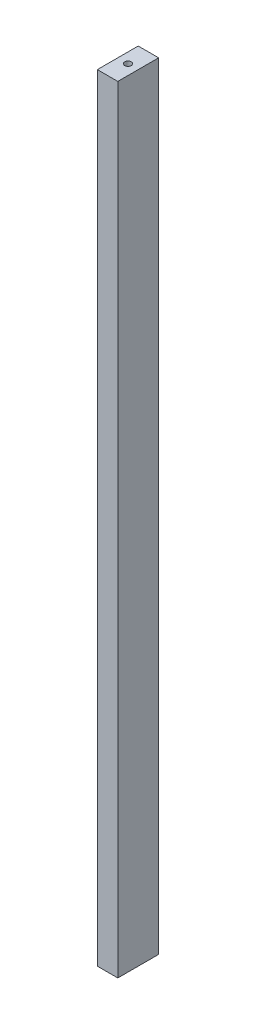
ISO-10303-21;
HEADER;
FILE_DESCRIPTION(('STEP AP214'),'2;1');
FILE_NAME('part.step','',(''),(''),'','','');
FILE_SCHEMA(('AUTOMOTIVE_DESIGN { 1 0 10303 214 1 1 1 1 }'));
ENDSEC;
DATA;
#1=APPLICATION_CONTEXT('core data for automotive mechanical design processes');
#2=APPLICATION_PROTOCOL_DEFINITION('international standard','automotive_design',2000,#1);
#3=PRODUCT_CONTEXT('',#1,'mechanical');
#4=PRODUCT('Part','Part','',(#3));
#5=PRODUCT_RELATED_PRODUCT_CATEGORY('part','',(#4));
#6=PRODUCT_DEFINITION_FORMATION('','',#4);
#7=PRODUCT_DEFINITION_CONTEXT('part definition',#1,'design');
#8=PRODUCT_DEFINITION('design','',#6,#7);
#9=PRODUCT_DEFINITION_SHAPE('','',#8);
#10=(LENGTH_UNIT() NAMED_UNIT(*) SI_UNIT(.MILLI.,.METRE.));
#11=(NAMED_UNIT(*) PLANE_ANGLE_UNIT() SI_UNIT($,.RADIAN.));
#12=(NAMED_UNIT(*) SI_UNIT($,.STERADIAN.) SOLID_ANGLE_UNIT());
#13=UNCERTAINTY_MEASURE_WITH_UNIT(LENGTH_MEASURE(1.E-05),#10,'distance_accuracy_value','');
#14=(GEOMETRIC_REPRESENTATION_CONTEXT(3) GLOBAL_UNCERTAINTY_ASSIGNED_CONTEXT((#13)) GLOBAL_UNIT_ASSIGNED_CONTEXT((#10,
#11,#12)) REPRESENTATION_CONTEXT('',''));
#15=CARTESIAN_POINT('',(0.,0.,0.));
#16=DIRECTION('',(0.,0.,1.));
#17=DIRECTION('',(1.,0.,0.));
#18=AXIS2_PLACEMENT_3D('',#15,#16,#17);
#19=CARTESIAN_POINT('',(-12.5,950.,-25.));
#20=DIRECTION('',(1.,0.,0.));
#21=DIRECTION('',(0.,0.,-1.));
#22=AXIS2_PLACEMENT_3D('',#19,#20,#21);
#23=PLANE('',#22);
#24=DIRECTION('',(0.,0.,1.));
#25=VECTOR('',#24,1.);
#26=CARTESIAN_POINT('',(-12.5,0.,-25.));
#27=LINE('',#26,#25);
#28=CARTESIAN_POINT('',(-12.5,0.,-25.));
#29=VERTEX_POINT('',#28);
#30=CARTESIAN_POINT('',(-12.5,0.,25.));
#31=VERTEX_POINT('',#30);
#32=EDGE_CURVE('E111',#29,#31,#27,.T.);
#33=ORIENTED_EDGE('',*,*,#32,.T.);
#34=DIRECTION('',(0.,-1.,0.));
#35=VECTOR('',#34,1.);
#36=CARTESIAN_POINT('',(-12.5,950.,25.));
#37=LINE('',#36,#35);
#38=CARTESIAN_POINT('',(-12.5,950.,25.));
#39=VERTEX_POINT('',#38);
#40=EDGE_CURVE('E11',#39,#31,#37,.T.);
#41=ORIENTED_EDGE('',*,*,#40,.F.);
#42=DIRECTION('',(0.,0.,1.));
#43=VECTOR('',#42,1.);
#44=CARTESIAN_POINT('',(-12.5,950.,-25.));
#45=LINE('',#44,#43);
#46=CARTESIAN_POINT('',(-12.5,950.,-25.));
#47=VERTEX_POINT('',#46);
#48=EDGE_CURVE('E95',#47,#39,#45,.T.);
#49=ORIENTED_EDGE('',*,*,#48,.F.);
#50=DIRECTION('',(0.,-1.,0.));
#51=VECTOR('',#50,1.);
#52=CARTESIAN_POINT('',(-12.5,950.,-25.));
#53=LINE('',#52,#51);
#54=EDGE_CURVE('E107',#47,#29,#53,.T.);
#55=ORIENTED_EDGE('',*,*,#54,.T.);
#56=EDGE_LOOP('',(#33,#41,#49,#55));
#57=FACE_BOUND('',#56,.T.);
#58=ADVANCED_FACE('F43',(#57),#23,.F.);
#59=CARTESIAN_POINT('',(12.5,950.,25.));
#60=DIRECTION('',(0.,0.,-1.));
#61=DIRECTION('',(-1.,0.,0.));
#62=AXIS2_PLACEMENT_3D('',#59,#60,#61);
#63=PLANE('',#62);
#64=DIRECTION('',(1.,0.,0.));
#65=VECTOR('',#64,1.);
#66=CARTESIAN_POINT('',(12.5,0.,25.));
#67=LINE('',#66,#65);
#68=CARTESIAN_POINT('',(12.5,0.,25.));
#69=VERTEX_POINT('',#68);
#70=EDGE_CURVE('E100',#31,#69,#67,.T.);
#71=ORIENTED_EDGE('',*,*,#70,.T.);
#72=DIRECTION('',(0.,-1.,0.));
#73=VECTOR('',#72,1.);
#74=CARTESIAN_POINT('',(12.5,950.,25.));
#75=LINE('',#74,#73);
#76=CARTESIAN_POINT('',(12.5,950.,25.));
#77=VERTEX_POINT('',#76);
#78=EDGE_CURVE('E52',#77,#69,#75,.T.);
#79=ORIENTED_EDGE('',*,*,#78,.F.);
#80=DIRECTION('',(1.,0.,0.));
#81=VECTOR('',#80,1.);
#82=CARTESIAN_POINT('',(12.5,950.,25.));
#83=LINE('',#82,#81);
#84=EDGE_CURVE('E90',#39,#77,#83,.T.);
#85=ORIENTED_EDGE('',*,*,#84,.F.);
#86=ORIENTED_EDGE('',*,*,#40,.T.);
#87=EDGE_LOOP('',(#71,#79,#85,#86));
#88=FACE_BOUND('',#87,.T.);
#89=ADVANCED_FACE('F99',(#88),#63,.F.);
#90=CARTESIAN_POINT('',(12.5,950.,-25.));
#91=DIRECTION('',(-1.,0.,0.));
#92=DIRECTION('',(0.,0.,1.));
#93=AXIS2_PLACEMENT_3D('',#90,#91,#92);
#94=PLANE('',#93);
#95=DIRECTION('',(0.,0.,-1.));
#96=VECTOR('',#95,1.);
#97=CARTESIAN_POINT('',(12.5,0.,-25.));
#98=LINE('',#97,#96);
#99=CARTESIAN_POINT('',(12.5,0.,-25.));
#100=VERTEX_POINT('',#99);
#101=EDGE_CURVE('E77',#69,#100,#98,.T.);
#102=ORIENTED_EDGE('',*,*,#101,.T.);
#103=DIRECTION('',(0.,-1.,0.));
#104=VECTOR('',#103,1.);
#105=CARTESIAN_POINT('',(12.5,950.,-25.));
#106=LINE('',#105,#104);
#107=CARTESIAN_POINT('',(12.5,950.,-25.));
#108=VERTEX_POINT('',#107);
#109=EDGE_CURVE('E102',#108,#100,#106,.T.);
#110=ORIENTED_EDGE('',*,*,#109,.F.);
#111=DIRECTION('',(0.,0.,-1.));
#112=VECTOR('',#111,1.);
#113=CARTESIAN_POINT('',(12.5,950.,-25.));
#114=LINE('',#113,#112);
#115=EDGE_CURVE('E93',#77,#108,#114,.T.);
#116=ORIENTED_EDGE('',*,*,#115,.F.);
#117=ORIENTED_EDGE('',*,*,#78,.T.);
#118=EDGE_LOOP('',(#102,#110,#116,#117));
#119=FACE_BOUND('',#118,.T.);
#120=ADVANCED_FACE('F103',(#119),#94,.F.);
#121=CARTESIAN_POINT('',(12.5,950.,-25.));
#122=DIRECTION('',(0.,0.,1.));
#123=DIRECTION('',(1.,0.,0.));
#124=AXIS2_PLACEMENT_3D('',#121,#122,#123);
#125=PLANE('',#124);
#126=DIRECTION('',(-1.,0.,0.));
#127=VECTOR('',#126,1.);
#128=CARTESIAN_POINT('',(12.5,0.,-25.));
#129=LINE('',#128,#127);
#130=EDGE_CURVE('E83',#100,#29,#129,.T.);
#131=ORIENTED_EDGE('',*,*,#130,.T.);
#132=ORIENTED_EDGE('',*,*,#54,.F.);
#133=DIRECTION('',(-1.,0.,0.));
#134=VECTOR('',#133,1.);
#135=CARTESIAN_POINT('',(12.5,950.,-25.));
#136=LINE('',#135,#134);
#137=EDGE_CURVE('E60',#108,#47,#136,.T.);
#138=ORIENTED_EDGE('',*,*,#137,.F.);
#139=ORIENTED_EDGE('',*,*,#109,.T.);
#140=EDGE_LOOP('',(#131,#132,#138,#139));
#141=FACE_BOUND('',#140,.T.);
#142=ADVANCED_FACE('F125',(#141),#125,.F.);
#143=CARTESIAN_POINT('',(0.,950.,0.));
#144=DIRECTION('',(0.,-1.,0.));
#145=DIRECTION('',(0.,0.,-1.));
#146=AXIS2_PLACEMENT_3D('',#143,#144,#145);
#147=PLANE('',#146);
#148=CARTESIAN_POINT('',(0.,950.,0.));
#149=DIRECTION('',(0.,1.,0.));
#150=DIRECTION('',(0.,0.,1.));
#151=AXIS2_PLACEMENT_3D('',#148,#149,#150);
#152=CIRCLE('',#151,4.);
#153=CARTESIAN_POINT('',(0.,950.,4.));
#154=VERTEX_POINT('',#153);
#155=EDGE_CURVE('E140',#154,#154,#152,.T.);
#156=ORIENTED_EDGE('',*,*,#155,.F.);
#157=EDGE_LOOP('',(#156));
#158=FACE_BOUND('',#157,.T.);
#159=ORIENTED_EDGE('',*,*,#48,.T.);
#160=ORIENTED_EDGE('',*,*,#84,.T.);
#161=ORIENTED_EDGE('',*,*,#115,.T.);
#162=ORIENTED_EDGE('',*,*,#137,.T.);
#163=EDGE_LOOP('',(#159,#160,#161,#162));
#164=FACE_BOUND('',#163,.T.);
#165=ADVANCED_FACE('F91',(#158,#164),#147,.F.);
#166=CARTESIAN_POINT('',(0.,0.,0.));
#167=DIRECTION('',(0.,-1.,0.));
#168=DIRECTION('',(0.,0.,-1.));
#169=AXIS2_PLACEMENT_3D('',#166,#167,#168);
#170=PLANE('',#169);
#171=CARTESIAN_POINT('',(0.,0.,0.));
#172=DIRECTION('',(0.,-1.,0.));
#173=DIRECTION('',(0.,0.,-1.));
#174=AXIS2_PLACEMENT_3D('',#171,#172,#173);
#175=CIRCLE('',#174,4.);
#176=CARTESIAN_POINT('',(0.,0.,-4.));
#177=VERTEX_POINT('',#176);
#178=EDGE_CURVE('E132',#177,#177,#175,.T.);
#179=ORIENTED_EDGE('',*,*,#178,.F.);
#180=EDGE_LOOP('',(#179));
#181=FACE_BOUND('',#180,.T.);
#182=ORIENTED_EDGE('',*,*,#32,.F.);
#183=ORIENTED_EDGE('',*,*,#130,.F.);
#184=ORIENTED_EDGE('',*,*,#101,.F.);
#185=ORIENTED_EDGE('',*,*,#70,.F.);
#186=EDGE_LOOP('',(#182,#183,#184,#185));
#187=FACE_BOUND('',#186,.T.);
#188=ADVANCED_FACE('F128',(#181,#187),#170,.T.);
#189=CARTESIAN_POINT('',(0.,50.,0.));
#190=DIRECTION('',(0.,-1.,0.));
#191=DIRECTION('',(0.,0.,-1.));
#192=AXIS2_PLACEMENT_3D('',#189,#190,#191);
#193=CYLINDRICAL_SURFACE('',#192,4.);
#194=CARTESIAN_POINT('',(0.,50.,0.));
#195=DIRECTION('',(0.,-1.,0.));
#196=DIRECTION('',(0.,0.,-1.));
#197=AXIS2_PLACEMENT_3D('',#194,#195,#196);
#198=CIRCLE('',#197,4.);
#199=CARTESIAN_POINT('',(0.,50.,-4.));
#200=VERTEX_POINT('',#199);
#201=EDGE_CURVE('E115',#200,#200,#198,.T.);
#202=ORIENTED_EDGE('',*,*,#201,.F.);
#203=EDGE_LOOP('',(#202));
#204=FACE_BOUND('',#203,.T.);
#205=ORIENTED_EDGE('',*,*,#178,.T.);
#206=EDGE_LOOP('',(#205));
#207=FACE_BOUND('',#206,.T.);
#208=ADVANCED_FACE('F163',(#204,#207),#193,.F.);
#209=CARTESIAN_POINT('',(0.,50.,0.));
#210=DIRECTION('',(0.,-1.,0.));
#211=DIRECTION('',(0.,0.,-1.));
#212=AXIS2_PLACEMENT_3D('',#209,#210,#211);
#213=PLANE('',#212);
#214=ORIENTED_EDGE('',*,*,#201,.T.);
#215=EDGE_LOOP('',(#214));
#216=FACE_BOUND('',#215,.T.);
#217=ADVANCED_FACE('F153',(#216),#213,.T.);
#218=CARTESIAN_POINT('',(0.,900.,0.));
#219=DIRECTION('',(0.,1.,0.));
#220=DIRECTION('',(0.,0.,1.));
#221=AXIS2_PLACEMENT_3D('',#218,#219,#220);
#222=CYLINDRICAL_SURFACE('',#221,4.);
#223=CARTESIAN_POINT('',(0.,900.,0.));
#224=DIRECTION('',(0.,1.,0.));
#225=DIRECTION('',(0.,0.,1.));
#226=AXIS2_PLACEMENT_3D('',#223,#224,#225);
#227=CIRCLE('',#226,4.);
#228=CARTESIAN_POINT('',(0.,900.,4.));
#229=VERTEX_POINT('',#228);
#230=EDGE_CURVE('E136',#229,#229,#227,.T.);
#231=ORIENTED_EDGE('',*,*,#230,.F.);
#232=EDGE_LOOP('',(#231));
#233=FACE_BOUND('',#232,.T.);
#234=ORIENTED_EDGE('',*,*,#155,.T.);
#235=EDGE_LOOP('',(#234));
#236=FACE_BOUND('',#235,.T.);
#237=ADVANCED_FACE('F150',(#233,#236),#222,.F.);
#238=CARTESIAN_POINT('',(0.,900.,0.));
#239=DIRECTION('',(0.,1.,0.));
#240=DIRECTION('',(0.,0.,1.));
#241=AXIS2_PLACEMENT_3D('',#238,#239,#240);
#242=PLANE('',#241);
#243=ORIENTED_EDGE('',*,*,#230,.T.);
#244=EDGE_LOOP('',(#243));
#245=FACE_BOUND('',#244,.T.);
#246=ADVANCED_FACE('F148',(#245),#242,.T.);
#247=CLOSED_SHELL('',(#58,#89,#120,#142,#165,#188,#208,#217,#237,#246));
#248=MANIFOLD_SOLID_BREP('B2',#247);
#249=ADVANCED_BREP_SHAPE_REPRESENTATION('',(#18,#248),#14);
#250=SHAPE_DEFINITION_REPRESENTATION(#9,#249);
ENDSEC;
END-ISO-10303-21;
